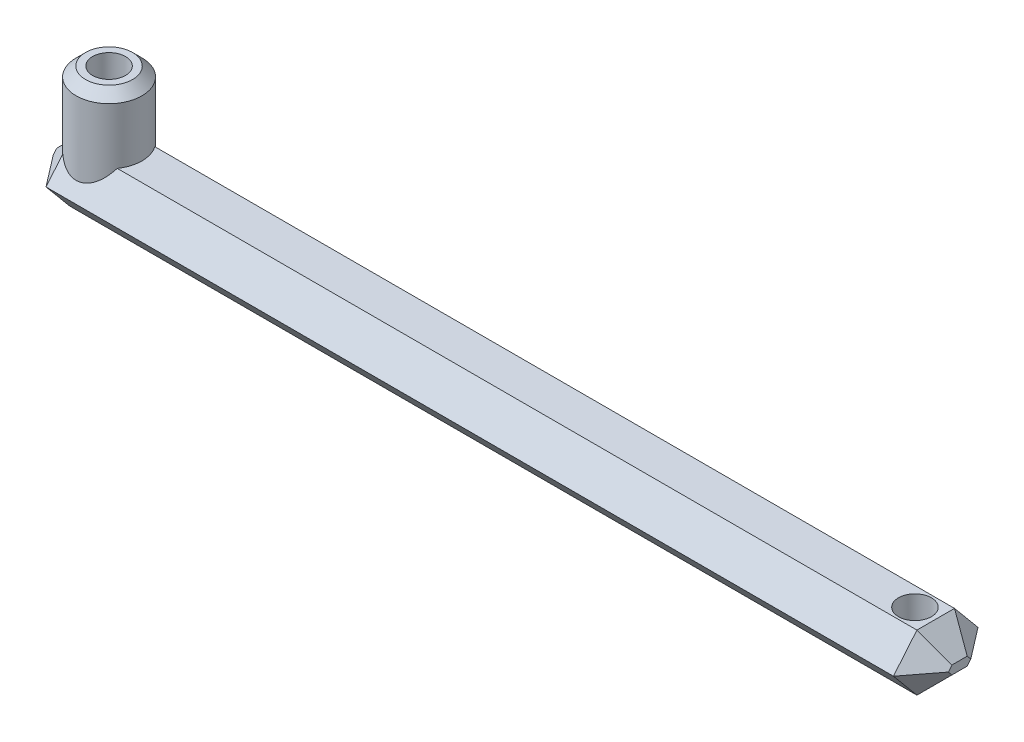
ISO-10303-21;
HEADER;
FILE_DESCRIPTION(('STEP AP214'),'2;1');
FILE_NAME('part.step','',(''),(''),'','','');
FILE_SCHEMA(('AUTOMOTIVE_DESIGN { 1 0 10303 214 1 1 1 1 }'));
ENDSEC;
DATA;
#1=APPLICATION_CONTEXT('core data for automotive mechanical design processes');
#2=APPLICATION_PROTOCOL_DEFINITION('international standard','automotive_design',2000,#1);
#3=PRODUCT_CONTEXT('',#1,'mechanical');
#4=PRODUCT('Part','Part','',(#3));
#5=PRODUCT_RELATED_PRODUCT_CATEGORY('part','',(#4));
#6=PRODUCT_DEFINITION_FORMATION('','',#4);
#7=PRODUCT_DEFINITION_CONTEXT('part definition',#1,'design');
#8=PRODUCT_DEFINITION('design','',#6,#7);
#9=PRODUCT_DEFINITION_SHAPE('','',#8);
#10=(LENGTH_UNIT() NAMED_UNIT(*) SI_UNIT(.MILLI.,.METRE.));
#11=(NAMED_UNIT(*) PLANE_ANGLE_UNIT() SI_UNIT($,.RADIAN.));
#12=(NAMED_UNIT(*) SI_UNIT($,.STERADIAN.) SOLID_ANGLE_UNIT());
#13=UNCERTAINTY_MEASURE_WITH_UNIT(LENGTH_MEASURE(1.E-05),#10,'distance_accuracy_value','');
#14=(GEOMETRIC_REPRESENTATION_CONTEXT(3) GLOBAL_UNCERTAINTY_ASSIGNED_CONTEXT((#13)) GLOBAL_UNIT_ASSIGNED_CONTEXT((#10,
#11,#12)) REPRESENTATION_CONTEXT('',''));
#15=CARTESIAN_POINT('',(0.,0.,0.));
#16=DIRECTION('',(0.,0.,1.));
#17=DIRECTION('',(1.,0.,0.));
#18=AXIS2_PLACEMENT_3D('',#15,#16,#17);
#19=CARTESIAN_POINT('',(47.625,3.,2.));
#20=DIRECTION('',(0.,1.,0.));
#21=DIRECTION('',(0.,0.,1.));
#22=AXIS2_PLACEMENT_3D('',#19,#20,#21);
#23=PLANE('',#22);
#24=CARTESIAN_POINT('',(-42.875,3.,0.));
#25=DIRECTION('',(0.,1.,0.));
#26=DIRECTION('',(0.,0.,1.));
#27=AXIS2_PLACEMENT_3D('',#24,#25,#26);
#28=CIRCLE('',#27,3.5);
#29=CARTESIAN_POINT('',(-40.002718676731,3.,2.));
#30=VERTEX_POINT('',#29);
#31=CARTESIAN_POINT('',(-40.002718676731,3.,-2.));
#32=VERTEX_POINT('',#31);
#33=EDGE_CURVE('E51',#30,#32,#28,.T.);
#34=ORIENTED_EDGE('',*,*,#33,.F.);
#35=DIRECTION('',(-1.,0.,0.));
#36=VECTOR('',#35,1.);
#37=CARTESIAN_POINT('',(47.625,3.,2.));
#38=LINE('',#37,#36);
#39=CARTESIAN_POINT('',(45.085,3.,2.));
#40=VERTEX_POINT('',#39);
#41=EDGE_CURVE('E157',#40,#30,#38,.T.);
#42=ORIENTED_EDGE('',*,*,#41,.F.);
#43=DIRECTION('',(0.,0.,-1.));
#44=VECTOR('',#43,1.);
#45=CARTESIAN_POINT('',(45.085,3.,-2.));
#46=LINE('',#45,#44);
#47=CARTESIAN_POINT('',(45.085,3.,-2.));
#48=VERTEX_POINT('',#47);
#49=EDGE_CURVE('E269',#40,#48,#46,.T.);
#50=ORIENTED_EDGE('',*,*,#49,.T.);
#51=DIRECTION('',(-1.,0.,0.));
#52=VECTOR('',#51,1.);
#53=CARTESIAN_POINT('',(47.625,3.,-2.));
#54=LINE('',#53,#52);
#55=EDGE_CURVE('E187',#48,#32,#54,.T.);
#56=ORIENTED_EDGE('',*,*,#55,.T.);
#57=EDGE_LOOP('',(#34,#42,#50,#56));
#58=FACE_BOUND('',#57,.T.);
#59=CARTESIAN_POINT('',(42.875,3.,0.));
#60=DIRECTION('',(0.,1.,0.));
#61=DIRECTION('',(0.,0.,1.));
#62=AXIS2_PLACEMENT_3D('',#59,#60,#61);
#63=CIRCLE('',#62,1.75);
#64=CARTESIAN_POINT('',(42.875,3.,1.75));
#65=VERTEX_POINT('',#64);
#66=EDGE_CURVE('E183',#65,#65,#63,.F.);
#67=ORIENTED_EDGE('',*,*,#66,.T.);
#68=EDGE_LOOP('',(#67));
#69=FACE_BOUND('',#68,.T.);
#70=ADVANCED_FACE('F36',(#58,#69),#23,.T.);
#71=CARTESIAN_POINT('',(47.625,0.,4.5));
#72=DIRECTION('',(0.,0.64018439966448,0.768221279597376));
#73=DIRECTION('',(0.,-0.768221279597376,0.64018439966448));
#74=AXIS2_PLACEMENT_3D('',#71,#72,#73);
#75=PLANE('',#74);
#76=CARTESIAN_POINT('',(-42.875,5.40000000000873,0.));
#77=DIRECTION('',(0.,0.64018439966448,0.768221279597376));
#78=DIRECTION('',(0.,0.768221279597376,-0.64018439966448));
#79=AXIS2_PLACEMENT_3D('',#76,#77,#78);
#80=ELLIPSE('',#79,5.46717477313466,3.5);
#81=CARTESIAN_POINT('',(-45.085,2.14317700817409,2.71401915985492));
#82=VERTEX_POINT('',#81);
#83=EDGE_CURVE('E155',#30,#82,#80,.F.);
#84=ORIENTED_EDGE('',*,*,#83,.T.);
#85=DIRECTION('',(0.,-0.768221279597376,0.64018439966448));
#86=VECTOR('',#85,1.);
#87=CARTESIAN_POINT('',(-45.085,0.,4.5));
#88=LINE('',#87,#86);
#89=CARTESIAN_POINT('',(-45.085,0.,4.5));
#90=VERTEX_POINT('',#89);
#91=EDGE_CURVE('E139',#82,#90,#88,.T.);
#92=ORIENTED_EDGE('',*,*,#91,.T.);
#93=DIRECTION('',(-1.,0.,0.));
#94=VECTOR('',#93,1.);
#95=CARTESIAN_POINT('',(47.625,0.,4.5));
#96=LINE('',#95,#94);
#97=CARTESIAN_POINT('',(45.085,0.,4.5));
#98=VERTEX_POINT('',#97);
#99=EDGE_CURVE('E190',#98,#90,#96,.T.);
#100=ORIENTED_EDGE('',*,*,#99,.F.);
#101=DIRECTION('',(0.,0.768221279597376,-0.64018439966448));
#102=VECTOR('',#101,1.);
#103=CARTESIAN_POINT('',(45.085,3.,2.));
#104=LINE('',#103,#102);
#105=EDGE_CURVE('E267',#98,#40,#104,.T.);
#106=ORIENTED_EDGE('',*,*,#105,.T.);
#107=ORIENTED_EDGE('',*,*,#41,.T.);
#108=EDGE_LOOP('',(#84,#92,#100,#106,#107));
#109=FACE_BOUND('',#108,.T.);
#110=ADVANCED_FACE('F156',(#109),#75,.T.);
#111=CARTESIAN_POINT('',(47.625,-3.,2.));
#112=DIRECTION('',(0.,-0.64018439966448,0.768221279597376));
#113=DIRECTION('',(0.,-0.768221279597376,-0.64018439966448));
#114=AXIS2_PLACEMENT_3D('',#111,#112,#113);
#115=PLANE('',#114);
#116=ORIENTED_EDGE('',*,*,#99,.T.);
#117=DIRECTION('',(0.,-0.768221279597376,-0.64018439966448));
#118=VECTOR('',#117,1.);
#119=CARTESIAN_POINT('',(-45.085,-3.,2.));
#120=LINE('',#119,#118);
#121=CARTESIAN_POINT('',(-45.085,-3.,2.));
#122=VERTEX_POINT('',#121);
#123=EDGE_CURVE('E151',#90,#122,#120,.T.);
#124=ORIENTED_EDGE('',*,*,#123,.T.);
#125=DIRECTION('',(-1.,0.,0.));
#126=VECTOR('',#125,1.);
#127=CARTESIAN_POINT('',(47.625,-3.,2.));
#128=LINE('',#127,#126);
#129=CARTESIAN_POINT('',(45.085,-3.,2.));
#130=VERTEX_POINT('',#129);
#131=EDGE_CURVE('E243',#130,#122,#128,.T.);
#132=ORIENTED_EDGE('',*,*,#131,.F.);
#133=DIRECTION('',(0.,0.768221279597376,0.64018439966448));
#134=VECTOR('',#133,1.);
#135=CARTESIAN_POINT('',(45.085,0.,4.5));
#136=LINE('',#135,#134);
#137=EDGE_CURVE('E265',#130,#98,#136,.T.);
#138=ORIENTED_EDGE('',*,*,#137,.T.);
#139=EDGE_LOOP('',(#116,#124,#132,#138));
#140=FACE_BOUND('',#139,.T.);
#141=ADVANCED_FACE('F304',(#140),#115,.T.);
#142=CARTESIAN_POINT('',(47.625,-3.,2.));
#143=DIRECTION('',(0.,1.,0.));
#144=DIRECTION('',(0.,0.,1.));
#145=AXIS2_PLACEMENT_3D('',#142,#143,#144);
#146=PLANE('',#145);
#147=CARTESIAN_POINT('',(-42.875,-3.,0.));
#148=DIRECTION('',(0.,1.,0.));
#149=DIRECTION('',(0.,0.,-1.));
#150=AXIS2_PLACEMENT_3D('',#147,#148,#149);
#151=CIRCLE('',#150,1.75);
#152=CARTESIAN_POINT('',(-42.875,-3.,-1.75));
#153=VERTEX_POINT('',#152);
#154=EDGE_CURVE('E175',#153,#153,#151,.T.);
#155=ORIENTED_EDGE('',*,*,#154,.T.);
#156=EDGE_LOOP('',(#155));
#157=FACE_BOUND('',#156,.T.);
#158=CARTESIAN_POINT('',(42.875,-3.,0.));
#159=DIRECTION('',(0.,-1.,0.));
#160=DIRECTION('',(0.,0.,-1.));
#161=AXIS2_PLACEMENT_3D('',#158,#159,#160);
#162=CIRCLE('',#161,1.75);
#163=CARTESIAN_POINT('',(42.875,-3.,-1.75));
#164=VERTEX_POINT('',#163);
#165=EDGE_CURVE('E180',#164,#164,#162,.T.);
#166=ORIENTED_EDGE('',*,*,#165,.F.);
#167=EDGE_LOOP('',(#166));
#168=FACE_BOUND('',#167,.T.);
#169=ORIENTED_EDGE('',*,*,#131,.T.);
#170=DIRECTION('',(0.,0.,-1.));
#171=VECTOR('',#170,1.);
#172=CARTESIAN_POINT('',(-45.085,-3.,-2.));
#173=LINE('',#172,#171);
#174=CARTESIAN_POINT('',(-45.085,-3.,-2.));
#175=VERTEX_POINT('',#174);
#176=EDGE_CURVE('E205',#122,#175,#173,.T.);
#177=ORIENTED_EDGE('',*,*,#176,.T.);
#178=DIRECTION('',(-1.,0.,0.));
#179=VECTOR('',#178,1.);
#180=CARTESIAN_POINT('',(47.625,-3.,-2.));
#181=LINE('',#180,#179);
#182=CARTESIAN_POINT('',(45.085,-3.,-2.));
#183=VERTEX_POINT('',#182);
#184=EDGE_CURVE('E238',#183,#175,#181,.T.);
#185=ORIENTED_EDGE('',*,*,#184,.F.);
#186=DIRECTION('',(0.,0.,1.));
#187=VECTOR('',#186,1.);
#188=CARTESIAN_POINT('',(45.085,-3.,2.));
#189=LINE('',#188,#187);
#190=EDGE_CURVE('E263',#183,#130,#189,.T.);
#191=ORIENTED_EDGE('',*,*,#190,.T.);
#192=EDGE_LOOP('',(#169,#177,#185,#191));
#193=FACE_BOUND('',#192,.T.);
#194=ADVANCED_FACE('F298',(#157,#168,#193),#146,.F.);
#195=CARTESIAN_POINT('',(47.625,0.,-4.5));
#196=DIRECTION('',(0.,-0.64018439966448,-0.768221279597376));
#197=DIRECTION('',(0.,0.768221279597376,-0.64018439966448));
#198=AXIS2_PLACEMENT_3D('',#195,#196,#197);
#199=PLANE('',#198);
#200=ORIENTED_EDGE('',*,*,#184,.T.);
#201=DIRECTION('',(0.,0.768221279597376,-0.64018439966448));
#202=VECTOR('',#201,1.);
#203=CARTESIAN_POINT('',(-45.085,0.,-4.5));
#204=LINE('',#203,#202);
#205=CARTESIAN_POINT('',(-45.085,0.,-4.5));
#206=VERTEX_POINT('',#205);
#207=EDGE_CURVE('E201',#175,#206,#204,.T.);
#208=ORIENTED_EDGE('',*,*,#207,.T.);
#209=DIRECTION('',(-1.,0.,0.));
#210=VECTOR('',#209,1.);
#211=CARTESIAN_POINT('',(47.625,0.,-4.5));
#212=LINE('',#211,#210);
#213=CARTESIAN_POINT('',(45.085,0.,-4.5));
#214=VERTEX_POINT('',#213);
#215=EDGE_CURVE('E236',#214,#206,#212,.T.);
#216=ORIENTED_EDGE('',*,*,#215,.F.);
#217=DIRECTION('',(0.,-0.768221279597376,0.64018439966448));
#218=VECTOR('',#217,1.);
#219=CARTESIAN_POINT('',(45.085,-3.,-2.));
#220=LINE('',#219,#218);
#221=EDGE_CURVE('E261',#214,#183,#220,.T.);
#222=ORIENTED_EDGE('',*,*,#221,.T.);
#223=EDGE_LOOP('',(#200,#208,#216,#222));
#224=FACE_BOUND('',#223,.T.);
#225=ADVANCED_FACE('F235',(#224),#199,.T.);
#226=CARTESIAN_POINT('',(47.625,3.,-2.));
#227=DIRECTION('',(0.,0.64018439966448,-0.768221279597376));
#228=DIRECTION('',(0.,0.768221279597376,0.64018439966448));
#229=AXIS2_PLACEMENT_3D('',#226,#227,#228);
#230=PLANE('',#229);
#231=CARTESIAN_POINT('',(-42.875,5.40000000000873,0.));
#232=DIRECTION('',(0.,0.64018439966448,-0.768221279597376));
#233=DIRECTION('',(0.,0.768221279597376,0.64018439966448));
#234=AXIS2_PLACEMENT_3D('',#231,#232,#233);
#235=ELLIPSE('',#234,5.46717477313466,3.5);
#236=CARTESIAN_POINT('',(-45.085,2.1431770081741,-2.71401915985492));
#237=VERTEX_POINT('',#236);
#238=EDGE_CURVE('E59',#237,#32,#235,.F.);
#239=ORIENTED_EDGE('',*,*,#238,.T.);
#240=ORIENTED_EDGE('',*,*,#55,.F.);
#241=DIRECTION('',(0.,-0.768221279597376,-0.64018439966448));
#242=VECTOR('',#241,1.);
#243=CARTESIAN_POINT('',(45.085,0.,-4.5));
#244=LINE('',#243,#242);
#245=EDGE_CURVE('E194',#48,#214,#244,.T.);
#246=ORIENTED_EDGE('',*,*,#245,.T.);
#247=ORIENTED_EDGE('',*,*,#215,.T.);
#248=DIRECTION('',(0.,0.768221279597376,0.64018439966448));
#249=VECTOR('',#248,1.);
#250=CARTESIAN_POINT('',(-45.085,3.,-2.));
#251=LINE('',#250,#249);
#252=EDGE_CURVE('E198',#206,#237,#251,.T.);
#253=ORIENTED_EDGE('',*,*,#252,.T.);
#254=EDGE_LOOP('',(#239,#240,#246,#247,#253));
#255=FACE_BOUND('',#254,.T.);
#256=ADVANCED_FACE('F240',(#255),#230,.T.);
#257=CARTESIAN_POINT('',(47.625,0.,0.));
#258=DIRECTION('',(-1.,0.,0.));
#259=DIRECTION('',(0.,0.,1.));
#260=AXIS2_PLACEMENT_3D('',#257,#258,#259);
#261=PLANE('',#260);
#262=DIRECTION('',(0.,0.768221279597376,-0.64018439966448));
#263=VECTOR('',#262,1.);
#264=CARTESIAN_POINT('',(47.625,1.62606837514778,-2.54871794982266));
#265=LINE('',#264,#263);
#266=CARTESIAN_POINT('',(47.625,-0.459999999999999,-0.810327637199516));
#267=VERTEX_POINT('',#266);
#268=CARTESIAN_POINT('',(47.625,0.,-1.19366097053285));
#269=VERTEX_POINT('',#268);
#270=EDGE_CURVE('E256',#267,#269,#265,.T.);
#271=ORIENTED_EDGE('',*,*,#270,.T.);
#272=DIRECTION('',(0.,0.768221279597376,0.64018439966448));
#273=VECTOR('',#272,1.);
#274=CARTESIAN_POINT('',(47.625,1.37393162485222,-0.0487179498226648));
#275=LINE('',#274,#273);
#276=CARTESIAN_POINT('',(47.625,0.459999999999999,-0.810327637199516));
#277=VERTEX_POINT('',#276);
#278=EDGE_CURVE('E258',#269,#277,#275,.T.);
#279=ORIENTED_EDGE('',*,*,#278,.T.);
#280=DIRECTION('',(0.,0.,1.));
#281=VECTOR('',#280,1.);
#282=CARTESIAN_POINT('',(47.625,0.459999999999999,2.));
#283=LINE('',#282,#281);
#284=CARTESIAN_POINT('',(47.625,0.459999999999999,0.810327637199516));
#285=VERTEX_POINT('',#284);
#286=EDGE_CURVE('E248',#277,#285,#283,.T.);
#287=ORIENTED_EDGE('',*,*,#286,.T.);
#288=DIRECTION('',(0.,-0.768221279597376,0.64018439966448));
#289=VECTOR('',#288,1.);
#290=CARTESIAN_POINT('',(47.625,-1.62606837514778,2.54871794982267));
#291=LINE('',#290,#289);
#292=CARTESIAN_POINT('',(47.625,0.,1.19366097053285));
#293=VERTEX_POINT('',#292);
#294=EDGE_CURVE('E250',#285,#293,#291,.T.);
#295=ORIENTED_EDGE('',*,*,#294,.T.);
#296=DIRECTION('',(0.,-0.768221279597376,-0.64018439966448));
#297=VECTOR('',#296,1.);
#298=CARTESIAN_POINT('',(47.625,-1.37393162485222,0.0487179498226647));
#299=LINE('',#298,#297);
#300=CARTESIAN_POINT('',(47.625,-0.459999999999999,0.810327637199516));
#301=VERTEX_POINT('',#300);
#302=EDGE_CURVE('E252',#293,#301,#299,.T.);
#303=ORIENTED_EDGE('',*,*,#302,.T.);
#304=DIRECTION('',(0.,0.,-1.));
#305=VECTOR('',#304,1.);
#306=CARTESIAN_POINT('',(47.625,-0.459999999999999,0.));
#307=LINE('',#306,#305);
#308=EDGE_CURVE('E254',#301,#267,#307,.T.);
#309=ORIENTED_EDGE('',*,*,#308,.T.);
#310=EDGE_LOOP('',(#271,#279,#287,#295,#303,#309));
#311=FACE_BOUND('',#310,.T.);
#312=ADVANCED_FACE('F399',(#311),#261,.F.);
#313=CARTESIAN_POINT('',(-47.625,0.,0.));
#314=DIRECTION('',(-1.,0.,0.));
#315=DIRECTION('',(0.,0.,1.));
#316=AXIS2_PLACEMENT_3D('',#313,#314,#315);
#317=PLANE('',#316);
#318=DIRECTION('',(0.,0.768221279597376,0.64018439966448));
#319=VECTOR('',#318,1.);
#320=CARTESIAN_POINT('',(-47.625,-0.587046378950581,0.704455654740697));
#321=LINE('',#320,#319);
#322=CARTESIAN_POINT('',(-47.625,-0.459999999999999,0.810327637199515));
#323=VERTEX_POINT('',#322);
#324=CARTESIAN_POINT('',(-47.625,0.,1.19366097053285));
#325=VERTEX_POINT('',#324);
#326=EDGE_CURVE('E292',#323,#325,#321,.T.);
#327=ORIENTED_EDGE('',*,*,#326,.T.);
#328=DIRECTION('',(0.,0.768221279597376,-0.64018439966448));
#329=VECTOR('',#328,1.);
#330=CARTESIAN_POINT('',(-47.625,0.587046378950582,0.704455654740698));
#331=LINE('',#330,#329);
#332=CARTESIAN_POINT('',(-47.625,0.459999999999999,0.810327637199517));
#333=VERTEX_POINT('',#332);
#334=EDGE_CURVE('E152',#325,#333,#331,.T.);
#335=ORIENTED_EDGE('',*,*,#334,.T.);
#336=DIRECTION('',(0.,0.,-1.));
#337=VECTOR('',#336,1.);
#338=CARTESIAN_POINT('',(-47.625,0.459999999999999,0.));
#339=LINE('',#338,#337);
#340=CARTESIAN_POINT('',(-47.625,0.459999999999999,-0.810327637199516));
#341=VERTEX_POINT('',#340);
#342=EDGE_CURVE('E271',#333,#341,#339,.T.);
#343=ORIENTED_EDGE('',*,*,#342,.T.);
#344=DIRECTION('',(0.,-0.768221279597376,-0.64018439966448));
#345=VECTOR('',#344,1.);
#346=CARTESIAN_POINT('',(-47.625,0.587046378950581,-0.704455654740698));
#347=LINE('',#346,#345);
#348=CARTESIAN_POINT('',(-47.625,0.,-1.19366097053285));
#349=VERTEX_POINT('',#348);
#350=EDGE_CURVE('E288',#341,#349,#347,.T.);
#351=ORIENTED_EDGE('',*,*,#350,.T.);
#352=DIRECTION('',(0.,-0.768221279597376,0.64018439966448));
#353=VECTOR('',#352,1.);
#354=CARTESIAN_POINT('',(-47.625,-0.587046378950581,-0.704455654740698));
#355=LINE('',#354,#353);
#356=CARTESIAN_POINT('',(-47.625,-0.459999999999999,-0.810327637199516));
#357=VERTEX_POINT('',#356);
#358=EDGE_CURVE('E231',#349,#357,#355,.T.);
#359=ORIENTED_EDGE('',*,*,#358,.T.);
#360=DIRECTION('',(0.,0.,1.));
#361=VECTOR('',#360,1.);
#362=CARTESIAN_POINT('',(-47.625,-0.459999999999999,2.));
#363=LINE('',#362,#361);
#364=EDGE_CURVE('E225',#357,#323,#363,.T.);
#365=ORIENTED_EDGE('',*,*,#364,.T.);
#366=EDGE_LOOP('',(#327,#335,#343,#351,#359,#365));
#367=FACE_BOUND('',#366,.T.);
#368=ADVANCED_FACE('F397',(#367),#317,.T.);
#369=CARTESIAN_POINT('',(42.875,7.94974746830584,0.));
#370=DIRECTION('',(0.,-1.,0.));
#371=DIRECTION('',(0.,0.,-1.));
#372=AXIS2_PLACEMENT_3D('',#369,#370,#371);
#373=CYLINDRICAL_SURFACE('',#372,1.75);
#374=ORIENTED_EDGE('',*,*,#165,.T.);
#375=EDGE_LOOP('',(#374));
#376=FACE_BOUND('',#375,.T.);
#377=ORIENTED_EDGE('',*,*,#66,.F.);
#378=EDGE_LOOP('',(#377));
#379=FACE_BOUND('',#378,.T.);
#380=ADVANCED_FACE('F369',(#376,#379),#373,.F.);
#381=CARTESIAN_POINT('',(45.085,-3.,2.));
#382=DIRECTION('',(0.70710678118655,-0.452678730212591,0.54321447625511));
#383=DIRECTION('',(0.,-0.768221279597376,-0.64018439966448));
#384=AXIS2_PLACEMENT_3D('',#381,#382,#383);
#385=PLANE('',#384);
#386=DIRECTION('',(-0.671250537349018,-0.671250537349022,0.314396934172876));
#387=VECTOR('',#386,1.);
#388=CARTESIAN_POINT('',(45.085,-3.,2.));
#389=LINE('',#388,#387);
#390=EDGE_CURVE('E281',#301,#130,#389,.T.);
#391=ORIENTED_EDGE('',*,*,#390,.F.);
#392=ORIENTED_EDGE('',*,*,#302,.F.);
#393=DIRECTION('',(0.609207699080169,0.,-0.793010705716793));
#394=VECTOR('',#393,1.);
#395=CARTESIAN_POINT('',(45.085,0.,4.5));
#396=LINE('',#395,#394);
#397=EDGE_CURVE('E184',#98,#293,#396,.T.);
#398=ORIENTED_EDGE('',*,*,#397,.F.);
#399=ORIENTED_EDGE('',*,*,#137,.F.);
#400=EDGE_LOOP('',(#391,#392,#398,#399));
#401=FACE_BOUND('',#400,.T.);
#402=ADVANCED_FACE('F310',(#401),#385,.T.);
#403=CARTESIAN_POINT('',(45.085,0.,4.5));
#404=DIRECTION('',(0.70710678118655,0.452678730212591,0.54321447625511));
#405=DIRECTION('',(0.,-0.768221279597376,0.64018439966448));
#406=AXIS2_PLACEMENT_3D('',#403,#404,#405);
#407=PLANE('',#406);
#408=ORIENTED_EDGE('',*,*,#397,.T.);
#409=ORIENTED_EDGE('',*,*,#294,.F.);
#410=DIRECTION('',(0.671250537349018,-0.671250537349022,-0.314396934172876));
#411=VECTOR('',#410,1.);
#412=CARTESIAN_POINT('',(45.085,3.,2.));
#413=LINE('',#412,#411);
#414=EDGE_CURVE('E278',#40,#285,#413,.T.);
#415=ORIENTED_EDGE('',*,*,#414,.F.);
#416=ORIENTED_EDGE('',*,*,#105,.F.);
#417=EDGE_LOOP('',(#408,#409,#415,#416));
#418=FACE_BOUND('',#417,.T.);
#419=ADVANCED_FACE('F314',(#418),#407,.T.);
#420=CARTESIAN_POINT('',(47.625,-0.459999999999999,0.));
#421=DIRECTION('',(-0.707106781186549,0.707106781186546,0.));
#422=DIRECTION('',(0.,0.,-1.));
#423=AXIS2_PLACEMENT_3D('',#420,#421,#422);
#424=PLANE('',#423);
#425=ORIENTED_EDGE('',*,*,#390,.T.);
#426=ORIENTED_EDGE('',*,*,#190,.F.);
#427=DIRECTION('',(-0.671250537349018,-0.671250537349022,-0.314396934172876));
#428=VECTOR('',#427,1.);
#429=CARTESIAN_POINT('',(47.7960108241769,-0.288989175823095,-0.730230451662903));
#430=LINE('',#429,#428);
#431=EDGE_CURVE('E275',#267,#183,#430,.T.);
#432=ORIENTED_EDGE('',*,*,#431,.F.);
#433=ORIENTED_EDGE('',*,*,#308,.F.);
#434=EDGE_LOOP('',(#425,#426,#432,#433));
#435=FACE_BOUND('',#434,.T.);
#436=ADVANCED_FACE('F361',(#435),#424,.F.);
#437=CARTESIAN_POINT('',(45.085,3.,2.));
#438=DIRECTION('',(0.707106781186549,0.707106781186546,0.));
#439=DIRECTION('',(0.,0.,1.));
#440=AXIS2_PLACEMENT_3D('',#437,#438,#439);
#441=PLANE('',#440);
#442=ORIENTED_EDGE('',*,*,#414,.T.);
#443=ORIENTED_EDGE('',*,*,#286,.F.);
#444=DIRECTION('',(-0.671250537349018,0.671250537349022,-0.314396934172876));
#445=VECTOR('',#444,1.);
#446=CARTESIAN_POINT('',(45.9291564440177,2.15584355598229,-1.60461827113078));
#447=LINE('',#446,#445);
#448=EDGE_CURVE('E273',#48,#277,#447,.F.);
#449=ORIENTED_EDGE('',*,*,#448,.F.);
#450=ORIENTED_EDGE('',*,*,#49,.F.);
#451=EDGE_LOOP('',(#442,#443,#449,#450));
#452=FACE_BOUND('',#451,.T.);
#453=ADVANCED_FACE('F319',(#452),#441,.T.);
#454=CARTESIAN_POINT('',(45.085,0.,-4.5));
#455=DIRECTION('',(0.70710678118655,-0.452678730212591,-0.54321447625511));
#456=DIRECTION('',(0.,0.768221279597376,-0.64018439966448));
#457=AXIS2_PLACEMENT_3D('',#454,#455,#456);
#458=PLANE('',#457);
#459=ORIENTED_EDGE('',*,*,#431,.T.);
#460=ORIENTED_EDGE('',*,*,#221,.F.);
#461=DIRECTION('',(0.609207699080169,0.,0.793010705716793));
#462=VECTOR('',#461,1.);
#463=CARTESIAN_POINT('',(45.085,0.,-4.5));
#464=LINE('',#463,#462);
#465=EDGE_CURVE('E178',#269,#214,#464,.F.);
#466=ORIENTED_EDGE('',*,*,#465,.F.);
#467=ORIENTED_EDGE('',*,*,#270,.F.);
#468=EDGE_LOOP('',(#459,#460,#466,#467));
#469=FACE_BOUND('',#468,.T.);
#470=ADVANCED_FACE('F354',(#469),#458,.T.);
#471=CARTESIAN_POINT('',(45.085,3.,-2.));
#472=DIRECTION('',(0.707106781186549,0.452678730212591,-0.54321447625511));
#473=DIRECTION('',(0.,0.768221279597376,0.64018439966448));
#474=AXIS2_PLACEMENT_3D('',#471,#472,#473);
#475=PLANE('',#474);
#476=ORIENTED_EDGE('',*,*,#448,.T.);
#477=ORIENTED_EDGE('',*,*,#278,.F.);
#478=ORIENTED_EDGE('',*,*,#465,.T.);
#479=ORIENTED_EDGE('',*,*,#245,.F.);
#480=EDGE_LOOP('',(#476,#477,#478,#479));
#481=FACE_BOUND('',#480,.T.);
#482=ADVANCED_FACE('F351',(#481),#475,.T.);
#483=CARTESIAN_POINT('',(-42.875,7.94974746830584,0.));
#484=DIRECTION('',(0.,-1.,0.));
#485=DIRECTION('',(0.,0.,-1.));
#486=AXIS2_PLACEMENT_3D('',#483,#484,#485);
#487=CYLINDRICAL_SURFACE('',#486,1.75);
#488=ORIENTED_EDGE('',*,*,#154,.F.);
#489=EDGE_LOOP('',(#488));
#490=FACE_BOUND('',#489,.T.);
#491=CARTESIAN_POINT('',(-42.875,10.,0.));
#492=DIRECTION('',(0.,1.,0.));
#493=DIRECTION('',(0.,0.,1.));
#494=AXIS2_PLACEMENT_3D('',#491,#492,#493);
#495=CIRCLE('',#494,1.75);
#496=CARTESIAN_POINT('',(-42.875,10.,1.75));
#497=VERTEX_POINT('',#496);
#498=EDGE_CURVE('E321',#497,#497,#495,.T.);
#499=ORIENTED_EDGE('',*,*,#498,.T.);
#500=EDGE_LOOP('',(#499));
#501=FACE_BOUND('',#500,.T.);
#502=ADVANCED_FACE('F329',(#490,#501),#487,.F.);
#503=CARTESIAN_POINT('',(-47.625,-0.587046378950581,-0.704455654740698));
#504=DIRECTION('',(0.707106781186546,0.452678730212594,0.543214476255113));
#505=DIRECTION('',(0.,-0.768221279597376,0.64018439966448));
#506=AXIS2_PLACEMENT_3D('',#503,#504,#505);
#507=PLANE('',#506);
#508=DIRECTION('',(-0.609207699080174,0.,0.79301070571679));
#509=VECTOR('',#508,1.);
#510=CARTESIAN_POINT('',(-47.8613391129351,0.,-0.886016390498611));
#511=LINE('',#510,#509);
#512=EDGE_CURVE('E216',#206,#349,#511,.T.);
#513=ORIENTED_EDGE('',*,*,#512,.F.);
#514=ORIENTED_EDGE('',*,*,#207,.F.);
#515=DIRECTION('',(0.671250537349022,-0.671250537349019,-0.314396934172875));
#516=VECTOR('',#515,1.);
#517=CARTESIAN_POINT('',(-47.5900989167026,-0.494901083297398,-0.826674430203733));
#518=LINE('',#517,#516);
#519=EDGE_CURVE('E179',#357,#175,#518,.T.);
#520=ORIENTED_EDGE('',*,*,#519,.F.);
#521=ORIENTED_EDGE('',*,*,#358,.F.);
#522=EDGE_LOOP('',(#513,#514,#520,#521));
#523=FACE_BOUND('',#522,.T.);
#524=ADVANCED_FACE('F230',(#523),#507,.F.);
#525=CARTESIAN_POINT('',(-45.085,-3.,2.));
#526=DIRECTION('',(-0.707106781186546,-0.70710678118655,0.));
#527=DIRECTION('',(0.,0.,1.));
#528=AXIS2_PLACEMENT_3D('',#525,#526,#527);
#529=PLANE('',#528);
#530=ORIENTED_EDGE('',*,*,#519,.T.);
#531=ORIENTED_EDGE('',*,*,#176,.F.);
#532=DIRECTION('',(0.671250537349022,-0.671250537349019,0.314396934172875));
#533=VECTOR('',#532,1.);
#534=CARTESIAN_POINT('',(-45.085,-3.,2.));
#535=LINE('',#534,#533);
#536=EDGE_CURVE('E213',#323,#122,#535,.T.);
#537=ORIENTED_EDGE('',*,*,#536,.F.);
#538=ORIENTED_EDGE('',*,*,#364,.F.);
#539=EDGE_LOOP('',(#530,#531,#537,#538));
#540=FACE_BOUND('',#539,.T.);
#541=ADVANCED_FACE('F223',(#540),#529,.T.);
#542=CARTESIAN_POINT('',(-47.625,0.587046378950581,-0.704455654740698));
#543=DIRECTION('',(0.707106781186546,-0.452678730212594,0.543214476255113));
#544=DIRECTION('',(0.,-0.768221279597376,-0.64018439966448));
#545=AXIS2_PLACEMENT_3D('',#542,#543,#544);
#546=PLANE('',#545);
#547=CARTESIAN_POINT('',(-42.875,8.85213035672905,0.));
#548=DIRECTION('',(0.707106781186546,-0.452678730212594,0.543214476255113));
#549=DIRECTION('',(0.358979079308869,0.891673688752289,0.275775367655349));
#550=AXIS2_PLACEMENT_3D('',#547,#548,#549);
#551=ELLIPSE('',#550,7.73175271203106,3.5);
#552=CARTESIAN_POINT('',(-46.0031287550702,2.08187124492983,-1.56997149393724));
#553=VERTEX_POINT('',#552);
#554=EDGE_CURVE('E165',#553,#237,#551,.T.);
#555=ORIENTED_EDGE('',*,*,#554,.T.);
#556=ORIENTED_EDGE('',*,*,#252,.F.);
#557=ORIENTED_EDGE('',*,*,#512,.T.);
#558=ORIENTED_EDGE('',*,*,#350,.F.);
#559=DIRECTION('',(-0.671250537349022,-0.671250537349019,0.314396934172875));
#560=VECTOR('',#559,1.);
#561=CARTESIAN_POINT('',(-47.7960108241769,0.288989175823097,-0.730230451662904));
#562=LINE('',#561,#560);
#563=EDGE_CURVE('E211',#553,#341,#562,.T.);
#564=ORIENTED_EDGE('',*,*,#563,.F.);
#565=EDGE_LOOP('',(#555,#556,#557,#558,#564));
#566=FACE_BOUND('',#565,.T.);
#567=ADVANCED_FACE('F379',(#566),#546,.F.);
#568=CARTESIAN_POINT('',(-47.625,-0.587046378950581,0.704455654740697));
#569=DIRECTION('',(0.707106781186546,0.452678730212594,-0.543214476255113));
#570=DIRECTION('',(0.,0.768221279597376,0.64018439966448));
#571=AXIS2_PLACEMENT_3D('',#568,#569,#570);
#572=PLANE('',#571);
#573=ORIENTED_EDGE('',*,*,#536,.T.);
#574=ORIENTED_EDGE('',*,*,#123,.F.);
#575=DIRECTION('',(-0.609207699080174,0.,-0.79301070571679));
#576=VECTOR('',#575,1.);
#577=CARTESIAN_POINT('',(-47.8613391129351,0.,0.886016390498611));
#578=LINE('',#577,#576);
#579=EDGE_CURVE('E147',#325,#90,#578,.F.);
#580=ORIENTED_EDGE('',*,*,#579,.F.);
#581=ORIENTED_EDGE('',*,*,#326,.F.);
#582=EDGE_LOOP('',(#573,#574,#580,#581));
#583=FACE_BOUND('',#582,.T.);
#584=ADVANCED_FACE('F375',(#583),#572,.F.);
#585=CARTESIAN_POINT('',(-47.625,0.459999999999999,0.));
#586=DIRECTION('',(0.707106781186546,-0.70710678118655,0.));
#587=DIRECTION('',(0.,0.,-1.));
#588=AXIS2_PLACEMENT_3D('',#585,#586,#587);
#589=PLANE('',#588);
#590=CARTESIAN_POINT('',(-42.875,5.20999999997684,0.));
#591=DIRECTION('',(0.707106781186546,-0.70710678118655,0.));
#592=DIRECTION('',(0.70710678118655,0.707106781186546,0.));
#593=AXIS2_PLACEMENT_3D('',#590,#591,#592);
#594=ELLIPSE('',#593,4.94974746830582,3.5);
#595=CARTESIAN_POINT('',(-46.0031287550676,2.08187124493239,1.56997149393845));
#596=VERTEX_POINT('',#595);
#597=EDGE_CURVE('E163',#596,#553,#594,.T.);
#598=ORIENTED_EDGE('',*,*,#597,.T.);
#599=ORIENTED_EDGE('',*,*,#563,.T.);
#600=ORIENTED_EDGE('',*,*,#342,.F.);
#601=DIRECTION('',(0.671250537349022,0.671250537349019,0.314396934172875));
#602=VECTOR('',#601,1.);
#603=CARTESIAN_POINT('',(-47.7960108241769,0.288989175823096,0.730230451662905));
#604=LINE('',#603,#602);
#605=EDGE_CURVE('E170',#596,#333,#604,.F.);
#606=ORIENTED_EDGE('',*,*,#605,.F.);
#607=EDGE_LOOP('',(#598,#599,#600,#606));
#608=FACE_BOUND('',#607,.T.);
#609=ADVANCED_FACE('F372',(#608),#589,.F.);
#610=CARTESIAN_POINT('',(-47.625,0.587046378950582,0.704455654740698));
#611=DIRECTION('',(0.707106781186546,-0.452678730212594,-0.543214476255113));
#612=DIRECTION('',(0.,0.768221279597376,-0.64018439966448));
#613=AXIS2_PLACEMENT_3D('',#610,#611,#612);
#614=PLANE('',#613);
#615=CARTESIAN_POINT('',(-42.875,8.85213035672905,0.));
#616=DIRECTION('',(0.707106781186546,-0.452678730212594,-0.543214476255113));
#617=DIRECTION('',(0.358979079308869,0.891673688752289,-0.275775367655349));
#618=AXIS2_PLACEMENT_3D('',#615,#616,#617);
#619=ELLIPSE('',#618,7.73175271203106,3.5);
#620=EDGE_CURVE('E143',#82,#596,#619,.T.);
#621=ORIENTED_EDGE('',*,*,#620,.T.);
#622=ORIENTED_EDGE('',*,*,#605,.T.);
#623=ORIENTED_EDGE('',*,*,#334,.F.);
#624=ORIENTED_EDGE('',*,*,#579,.T.);
#625=ORIENTED_EDGE('',*,*,#91,.F.);
#626=EDGE_LOOP('',(#621,#622,#623,#624,#625));
#627=FACE_BOUND('',#626,.T.);
#628=ADVANCED_FACE('F141',(#627),#614,.F.);
#629=CARTESIAN_POINT('',(-42.875,-500000.,0.));
#630=DIRECTION('',(0.,1.,0.));
#631=DIRECTION('',(0.,0.,1.));
#632=AXIS2_PLACEMENT_3D('',#629,#630,#631);
#633=CYLINDRICAL_SURFACE('',#632,3.5);
#634=CARTESIAN_POINT('',(-42.875,9.00000000001455,0.));
#635=DIRECTION('',(0.,1.,0.));
#636=DIRECTION('',(0.,0.,1.));
#637=AXIS2_PLACEMENT_3D('',#634,#635,#636);
#638=CIRCLE('',#637,3.5);
#639=CARTESIAN_POINT('',(-42.875,9.00000000001455,3.5));
#640=VERTEX_POINT('',#639);
#641=EDGE_CURVE('E11',#640,#640,#638,.F.);
#642=ORIENTED_EDGE('',*,*,#641,.T.);
#643=EDGE_LOOP('',(#642));
#644=FACE_BOUND('',#643,.T.);
#645=ORIENTED_EDGE('',*,*,#83,.F.);
#646=ORIENTED_EDGE('',*,*,#33,.T.);
#647=ORIENTED_EDGE('',*,*,#238,.F.);
#648=ORIENTED_EDGE('',*,*,#554,.F.);
#649=ORIENTED_EDGE('',*,*,#597,.F.);
#650=ORIENTED_EDGE('',*,*,#620,.F.);
#651=EDGE_LOOP('',(#645,#646,#647,#648,#649,#650));
#652=FACE_BOUND('',#651,.T.);
#653=ADVANCED_FACE('F161',(#644,#652),#633,.T.);
#654=CARTESIAN_POINT('',(-42.875,10.,0.));
#655=DIRECTION('',(0.,1.,0.));
#656=DIRECTION('',(0.,0.,1.));
#657=AXIS2_PLACEMENT_3D('',#654,#655,#656);
#658=PLANE('',#657);
#659=CARTESIAN_POINT('',(-42.875,10.,0.));
#660=DIRECTION('',(0.,1.,0.));
#661=DIRECTION('',(0.,0.,1.));
#662=AXIS2_PLACEMENT_3D('',#659,#660,#661);
#663=CIRCLE('',#662,2.49999999999596);
#664=CARTESIAN_POINT('',(-42.875,10.,2.49999999999596));
#665=VERTEX_POINT('',#664);
#666=EDGE_CURVE('E44',#665,#665,#663,.T.);
#667=ORIENTED_EDGE('',*,*,#666,.T.);
#668=EDGE_LOOP('',(#667));
#669=FACE_BOUND('',#668,.T.);
#670=ORIENTED_EDGE('',*,*,#498,.F.);
#671=EDGE_LOOP('',(#670));
#672=FACE_BOUND('',#671,.T.);
#673=ADVANCED_FACE('F331',(#669,#672),#658,.T.);
#674=CARTESIAN_POINT('',(-42.875,9.99999999999091,0.));
#675=DIRECTION('',(0.,-1.,0.));
#676=DIRECTION('',(0.,0.,-1.));
#677=AXIS2_PLACEMENT_3D('',#674,#675,#676);
#678=CONICAL_SURFACE('',#677,2.50000000000505,0.785398163406745);
#679=ORIENTED_EDGE('',*,*,#641,.F.);
#680=EDGE_LOOP('',(#679));
#681=FACE_BOUND('',#680,.T.);
#682=ORIENTED_EDGE('',*,*,#666,.F.);
#683=EDGE_LOOP('',(#682));
#684=FACE_BOUND('',#683,.T.);
#685=ADVANCED_FACE('F38',(#681,#684),#678,.T.);
#686=CLOSED_SHELL('',(#70,#110,#141,#194,#225,#256,#312,#368,#380,#402,#419,#436,#453,#470,#482,
#502,#524,#541,#567,#584,#609,#628,#653,#673,#685));
#687=MANIFOLD_SOLID_BREP('B2',#686);
#688=ADVANCED_BREP_SHAPE_REPRESENTATION('',(#18,#687),#14);
#689=SHAPE_DEFINITION_REPRESENTATION(#9,#688);
ENDSEC;
END-ISO-10303-21;
